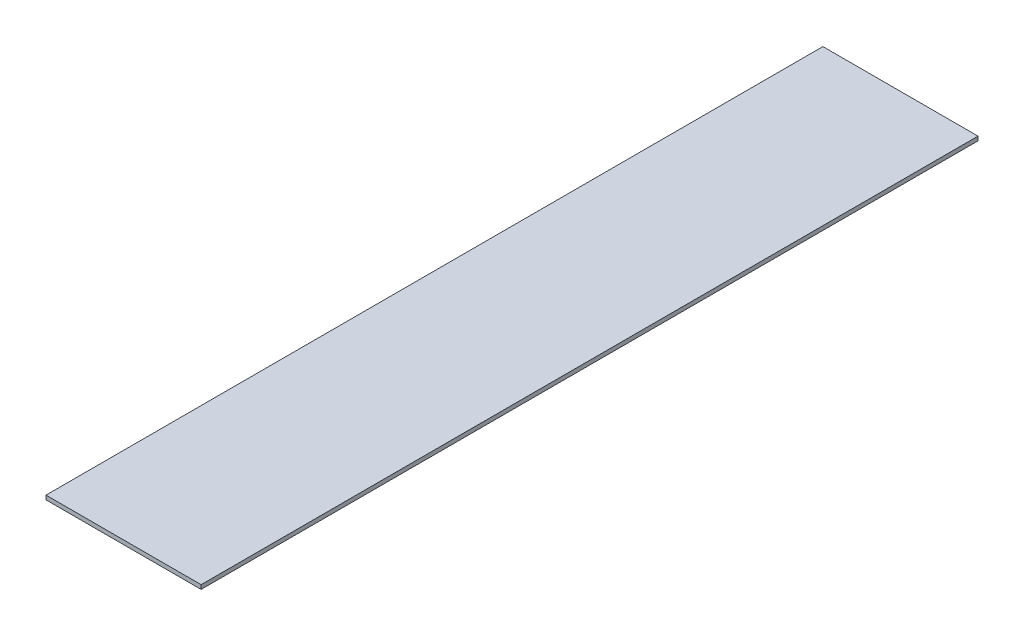
ISO-10303-21;
HEADER;
FILE_DESCRIPTION(('STEP AP214'),'2;1');
FILE_NAME('part.step','',(''),(''),'','','');
FILE_SCHEMA(('AUTOMOTIVE_DESIGN { 1 0 10303 214 1 1 1 1 }'));
ENDSEC;
DATA;
#1=APPLICATION_CONTEXT('core data for automotive mechanical design processes');
#2=APPLICATION_PROTOCOL_DEFINITION('international standard','automotive_design',2000,#1);
#3=PRODUCT_CONTEXT('',#1,'mechanical');
#4=PRODUCT('Part','Part','',(#3));
#5=PRODUCT_RELATED_PRODUCT_CATEGORY('part','',(#4));
#6=PRODUCT_DEFINITION_FORMATION('','',#4);
#7=PRODUCT_DEFINITION_CONTEXT('part definition',#1,'design');
#8=PRODUCT_DEFINITION('design','',#6,#7);
#9=PRODUCT_DEFINITION_SHAPE('','',#8);
#10=(LENGTH_UNIT() NAMED_UNIT(*) SI_UNIT(.MILLI.,.METRE.));
#11=(NAMED_UNIT(*) PLANE_ANGLE_UNIT() SI_UNIT($,.RADIAN.));
#12=(NAMED_UNIT(*) SI_UNIT($,.STERADIAN.) SOLID_ANGLE_UNIT());
#13=UNCERTAINTY_MEASURE_WITH_UNIT(LENGTH_MEASURE(1.E-05),#10,'distance_accuracy_value','');
#14=(GEOMETRIC_REPRESENTATION_CONTEXT(3) GLOBAL_UNCERTAINTY_ASSIGNED_CONTEXT((#13)) GLOBAL_UNIT_ASSIGNED_CONTEXT((#10,
#11,#12)) REPRESENTATION_CONTEXT('',''));
#15=CARTESIAN_POINT('',(0.,0.,0.));
#16=DIRECTION('',(0.,0.,1.));
#17=DIRECTION('',(1.,0.,0.));
#18=AXIS2_PLACEMENT_3D('',#15,#16,#17);
#19=CARTESIAN_POINT('',(0.,3.,0.));
#20=DIRECTION('',(1.,0.,0.));
#21=DIRECTION('',(0.,0.,-1.));
#22=AXIS2_PLACEMENT_3D('',#19,#20,#21);
#23=PLANE('',#22);
#24=DIRECTION('',(0.,0.,1.));
#25=VECTOR('',#24,1.);
#26=CARTESIAN_POINT('',(0.,0.,0.));
#27=LINE('',#26,#25);
#28=CARTESIAN_POINT('',(0.,0.,-566.));
#29=VERTEX_POINT('',#28);
#30=CARTESIAN_POINT('',(0.,0.,0.));
#31=VERTEX_POINT('',#30);
#32=EDGE_CURVE('E96',#29,#31,#27,.T.);
#33=ORIENTED_EDGE('',*,*,#32,.T.);
#34=DIRECTION('',(0.,-1.,0.));
#35=VECTOR('',#34,1.);
#36=CARTESIAN_POINT('',(0.,3.,0.));
#37=LINE('',#36,#35);
#38=CARTESIAN_POINT('',(0.,3.,0.));
#39=VERTEX_POINT('',#38);
#40=EDGE_CURVE('E11',#39,#31,#37,.T.);
#41=ORIENTED_EDGE('',*,*,#40,.F.);
#42=DIRECTION('',(0.,0.,1.));
#43=VECTOR('',#42,1.);
#44=CARTESIAN_POINT('',(0.,3.,0.));
#45=LINE('',#44,#43);
#46=CARTESIAN_POINT('',(0.,3.,-566.));
#47=VERTEX_POINT('',#46);
#48=EDGE_CURVE('E84',#47,#39,#45,.T.);
#49=ORIENTED_EDGE('',*,*,#48,.F.);
#50=DIRECTION('',(0.,-1.,0.));
#51=VECTOR('',#50,1.);
#52=CARTESIAN_POINT('',(0.,3.,-566.));
#53=LINE('',#52,#51);
#54=EDGE_CURVE('E92',#47,#29,#53,.T.);
#55=ORIENTED_EDGE('',*,*,#54,.T.);
#56=EDGE_LOOP('',(#33,#41,#49,#55));
#57=FACE_BOUND('',#56,.T.);
#58=ADVANCED_FACE('F33',(#57),#23,.F.);
#59=CARTESIAN_POINT('',(0.,3.,0.));
#60=DIRECTION('',(0.,0.,-1.));
#61=DIRECTION('',(-1.,0.,0.));
#62=AXIS2_PLACEMENT_3D('',#59,#60,#61);
#63=PLANE('',#62);
#64=DIRECTION('',(1.,0.,0.));
#65=VECTOR('',#64,1.);
#66=CARTESIAN_POINT('',(0.,0.,0.));
#67=LINE('',#66,#65);
#68=CARTESIAN_POINT('',(113.,0.,0.));
#69=VERTEX_POINT('',#68);
#70=EDGE_CURVE('E88',#31,#69,#67,.T.);
#71=ORIENTED_EDGE('',*,*,#70,.T.);
#72=DIRECTION('',(0.,-1.,0.));
#73=VECTOR('',#72,1.);
#74=CARTESIAN_POINT('',(113.,3.,0.));
#75=LINE('',#74,#73);
#76=CARTESIAN_POINT('',(113.,3.,0.));
#77=VERTEX_POINT('',#76);
#78=EDGE_CURVE('E41',#77,#69,#75,.T.);
#79=ORIENTED_EDGE('',*,*,#78,.F.);
#80=DIRECTION('',(1.,0.,0.));
#81=VECTOR('',#80,1.);
#82=CARTESIAN_POINT('',(0.,3.,0.));
#83=LINE('',#82,#81);
#84=EDGE_CURVE('E79',#39,#77,#83,.T.);
#85=ORIENTED_EDGE('',*,*,#84,.F.);
#86=ORIENTED_EDGE('',*,*,#40,.T.);
#87=EDGE_LOOP('',(#71,#79,#85,#86));
#88=FACE_BOUND('',#87,.T.);
#89=ADVANCED_FACE('F87',(#88),#63,.F.);
#90=CARTESIAN_POINT('',(113.,3.,0.));
#91=DIRECTION('',(-1.,0.,0.));
#92=DIRECTION('',(0.,0.,1.));
#93=AXIS2_PLACEMENT_3D('',#90,#91,#92);
#94=PLANE('',#93);
#95=DIRECTION('',(0.,0.,-1.));
#96=VECTOR('',#95,1.);
#97=CARTESIAN_POINT('',(113.,0.,0.));
#98=LINE('',#97,#96);
#99=CARTESIAN_POINT('',(113.,0.,-566.));
#100=VERTEX_POINT('',#99);
#101=EDGE_CURVE('E66',#69,#100,#98,.T.);
#102=ORIENTED_EDGE('',*,*,#101,.T.);
#103=DIRECTION('',(0.,-1.,0.));
#104=VECTOR('',#103,1.);
#105=CARTESIAN_POINT('',(113.,3.,-566.));
#106=LINE('',#105,#104);
#107=CARTESIAN_POINT('',(113.,3.,-566.));
#108=VERTEX_POINT('',#107);
#109=EDGE_CURVE('E89',#108,#100,#106,.T.);
#110=ORIENTED_EDGE('',*,*,#109,.F.);
#111=DIRECTION('',(0.,0.,-1.));
#112=VECTOR('',#111,1.);
#113=CARTESIAN_POINT('',(113.,3.,0.));
#114=LINE('',#113,#112);
#115=EDGE_CURVE('E82',#77,#108,#114,.T.);
#116=ORIENTED_EDGE('',*,*,#115,.F.);
#117=ORIENTED_EDGE('',*,*,#78,.T.);
#118=EDGE_LOOP('',(#102,#110,#116,#117));
#119=FACE_BOUND('',#118,.T.);
#120=ADVANCED_FACE('F90',(#119),#94,.F.);
#121=CARTESIAN_POINT('',(0.,3.,-566.));
#122=DIRECTION('',(0.,0.,1.));
#123=DIRECTION('',(1.,0.,0.));
#124=AXIS2_PLACEMENT_3D('',#121,#122,#123);
#125=PLANE('',#124);
#126=DIRECTION('',(-1.,0.,0.));
#127=VECTOR('',#126,1.);
#128=CARTESIAN_POINT('',(0.,0.,-566.));
#129=LINE('',#128,#127);
#130=EDGE_CURVE('E72',#100,#29,#129,.T.);
#131=ORIENTED_EDGE('',*,*,#130,.T.);
#132=ORIENTED_EDGE('',*,*,#54,.F.);
#133=DIRECTION('',(-1.,0.,0.));
#134=VECTOR('',#133,1.);
#135=CARTESIAN_POINT('',(0.,3.,-566.));
#136=LINE('',#135,#134);
#137=EDGE_CURVE('E49',#108,#47,#136,.T.);
#138=ORIENTED_EDGE('',*,*,#137,.F.);
#139=ORIENTED_EDGE('',*,*,#109,.T.);
#140=EDGE_LOOP('',(#131,#132,#138,#139));
#141=FACE_BOUND('',#140,.T.);
#142=ADVANCED_FACE('F103',(#141),#125,.F.);
#143=CARTESIAN_POINT('',(0.,3.,0.));
#144=DIRECTION('',(0.,-1.,0.));
#145=DIRECTION('',(0.,0.,-1.));
#146=AXIS2_PLACEMENT_3D('',#143,#144,#145);
#147=PLANE('',#146);
#148=ORIENTED_EDGE('',*,*,#48,.T.);
#149=ORIENTED_EDGE('',*,*,#84,.T.);
#150=ORIENTED_EDGE('',*,*,#115,.T.);
#151=ORIENTED_EDGE('',*,*,#137,.T.);
#152=EDGE_LOOP('',(#148,#149,#150,#151));
#153=FACE_BOUND('',#152,.T.);
#154=ADVANCED_FACE('F80',(#153),#147,.F.);
#155=CARTESIAN_POINT('',(0.,0.,0.));
#156=DIRECTION('',(0.,-1.,0.));
#157=DIRECTION('',(0.,0.,-1.));
#158=AXIS2_PLACEMENT_3D('',#155,#156,#157);
#159=PLANE('',#158);
#160=ORIENTED_EDGE('',*,*,#32,.F.);
#161=ORIENTED_EDGE('',*,*,#130,.F.);
#162=ORIENTED_EDGE('',*,*,#101,.F.);
#163=ORIENTED_EDGE('',*,*,#70,.F.);
#164=EDGE_LOOP('',(#160,#161,#162,#163));
#165=FACE_BOUND('',#164,.T.);
#166=ADVANCED_FACE('F106',(#165),#159,.T.);
#167=CLOSED_SHELL('',(#58,#89,#120,#142,#154,#166));
#168=MANIFOLD_SOLID_BREP('B2',#167);
#169=ADVANCED_BREP_SHAPE_REPRESENTATION('',(#18,#168),#14);
#170=SHAPE_DEFINITION_REPRESENTATION(#9,#169);
ENDSEC;
END-ISO-10303-21;
